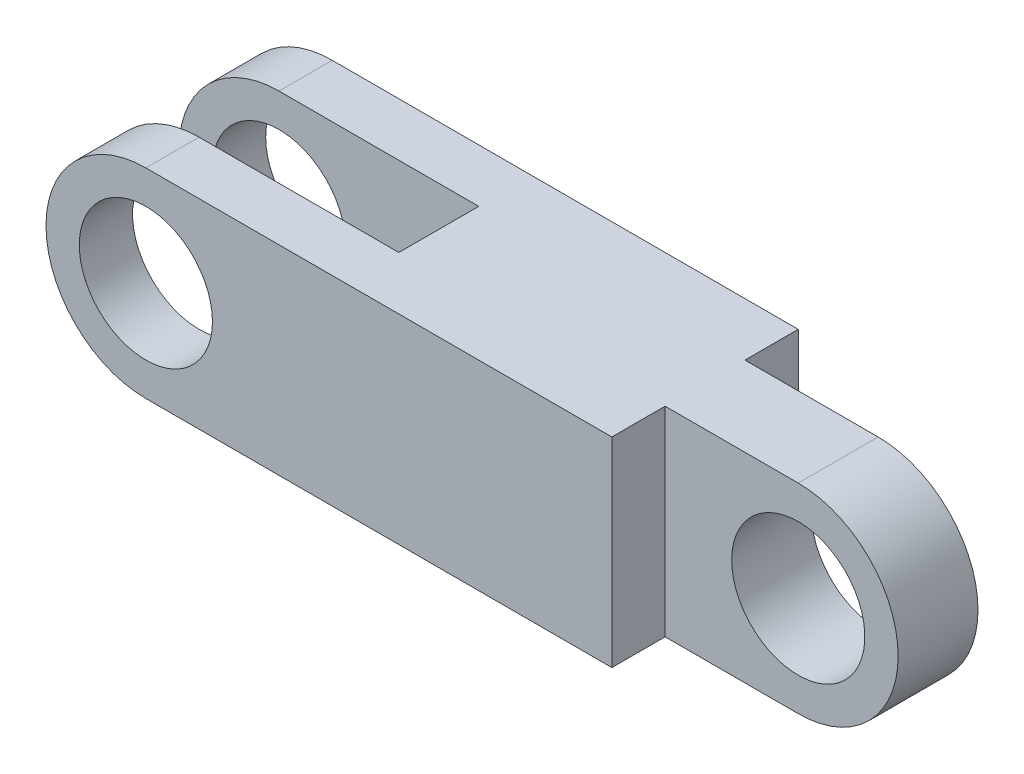
ISO-10303-21;
HEADER;
FILE_DESCRIPTION(('STEP AP214'),'2;1');
FILE_NAME('part.step','',(''),(''),'','','');
FILE_SCHEMA(('AUTOMOTIVE_DESIGN { 1 0 10303 214 1 1 1 1 }'));
ENDSEC;
DATA;
#1=APPLICATION_CONTEXT('core data for automotive mechanical design processes');
#2=APPLICATION_PROTOCOL_DEFINITION('international standard','automotive_design',2000,#1);
#3=PRODUCT_CONTEXT('',#1,'mechanical');
#4=PRODUCT('Part','Part','',(#3));
#5=PRODUCT_RELATED_PRODUCT_CATEGORY('part','',(#4));
#6=PRODUCT_DEFINITION_FORMATION('','',#4);
#7=PRODUCT_DEFINITION_CONTEXT('part definition',#1,'design');
#8=PRODUCT_DEFINITION('design','',#6,#7);
#9=PRODUCT_DEFINITION_SHAPE('','',#8);
#10=(LENGTH_UNIT() NAMED_UNIT(*) SI_UNIT(.MILLI.,.METRE.));
#11=(NAMED_UNIT(*) PLANE_ANGLE_UNIT() SI_UNIT($,.RADIAN.));
#12=(NAMED_UNIT(*) SI_UNIT($,.STERADIAN.) SOLID_ANGLE_UNIT());
#13=UNCERTAINTY_MEASURE_WITH_UNIT(LENGTH_MEASURE(1.E-05),#10,'distance_accuracy_value','');
#14=(GEOMETRIC_REPRESENTATION_CONTEXT(3) GLOBAL_UNCERTAINTY_ASSIGNED_CONTEXT((#13)) GLOBAL_UNIT_ASSIGNED_CONTEXT((#10,
#11,#12)) REPRESENTATION_CONTEXT('',''));
#15=CARTESIAN_POINT('',(0.,0.,0.));
#16=DIRECTION('',(0.,0.,1.));
#17=DIRECTION('',(1.,0.,0.));
#18=AXIS2_PLACEMENT_3D('',#15,#16,#17);
#19=CARTESIAN_POINT('',(0.,0.,14.));
#20=DIRECTION('',(0.,0.,1.));
#21=DIRECTION('',(1.,0.,0.));
#22=AXIS2_PLACEMENT_3D('',#19,#20,#21);
#23=PLANE('',#22);
#24=CARTESIAN_POINT('',(0.,7.5,14.));
#25=DIRECTION('',(0.,0.,1.));
#26=DIRECTION('',(1.,0.,0.));
#27=AXIS2_PLACEMENT_3D('',#24,#25,#26);
#28=CIRCLE('',#27,5.);
#29=CARTESIAN_POINT('',(5.,7.5,14.));
#30=VERTEX_POINT('',#29);
#31=EDGE_CURVE('E211',#30,#30,#28,.T.);
#32=ORIENTED_EDGE('',*,*,#31,.F.);
#33=EDGE_LOOP('',(#32));
#34=FACE_BOUND('',#33,.T.);
#35=DIRECTION('',(1.,0.,0.));
#36=VECTOR('',#35,1.);
#37=CARTESIAN_POINT('',(0.,0.,14.));
#38=LINE('',#37,#36);
#39=CARTESIAN_POINT('',(0.,0.,14.));
#40=VERTEX_POINT('',#39);
#41=CARTESIAN_POINT('',(35.,0.,14.));
#42=VERTEX_POINT('',#41);
#43=EDGE_CURVE('E208',#40,#42,#38,.T.);
#44=ORIENTED_EDGE('',*,*,#43,.T.);
#45=DIRECTION('',(0.,1.,0.));
#46=VECTOR('',#45,1.);
#47=CARTESIAN_POINT('',(35.,0.,14.));
#48=LINE('',#47,#46);
#49=CARTESIAN_POINT('',(35.,15.,14.));
#50=VERTEX_POINT('',#49);
#51=EDGE_CURVE('E171',#42,#50,#48,.T.);
#52=ORIENTED_EDGE('',*,*,#51,.T.);
#53=DIRECTION('',(1.,0.,0.));
#54=VECTOR('',#53,1.);
#55=CARTESIAN_POINT('',(0.,15.,14.));
#56=LINE('',#55,#54);
#57=CARTESIAN_POINT('',(0.,15.,14.));
#58=VERTEX_POINT('',#57);
#59=EDGE_CURVE('E202',#58,#50,#56,.T.);
#60=ORIENTED_EDGE('',*,*,#59,.F.);
#61=CARTESIAN_POINT('',(0.,7.5,14.));
#62=DIRECTION('',(0.,0.,1.));
#63=DIRECTION('',(1.,0.,0.));
#64=AXIS2_PLACEMENT_3D('',#61,#62,#63);
#65=CIRCLE('',#64,7.5);
#66=EDGE_CURVE('E205',#58,#40,#65,.T.);
#67=ORIENTED_EDGE('',*,*,#66,.T.);
#68=EDGE_LOOP('',(#44,#52,#60,#67));
#69=FACE_BOUND('',#68,.T.);
#70=ADVANCED_FACE('F41',(#34,#69),#23,.T.);
#71=CARTESIAN_POINT('',(0.,0.,0.));
#72=DIRECTION('',(0.,0.,1.));
#73=DIRECTION('',(1.,0.,0.));
#74=AXIS2_PLACEMENT_3D('',#71,#72,#73);
#75=PLANE('',#74);
#76=DIRECTION('',(1.,0.,0.));
#77=VECTOR('',#76,1.);
#78=CARTESIAN_POINT('',(0.,15.,0.));
#79=LINE('',#78,#77);
#80=CARTESIAN_POINT('',(0.,15.,0.));
#81=VERTEX_POINT('',#80);
#82=CARTESIAN_POINT('',(35.,15.,0.));
#83=VERTEX_POINT('',#82);
#84=EDGE_CURVE('E201',#81,#83,#79,.T.);
#85=ORIENTED_EDGE('',*,*,#84,.T.);
#86=DIRECTION('',(0.,1.,0.));
#87=VECTOR('',#86,1.);
#88=CARTESIAN_POINT('',(35.,0.,0.));
#89=LINE('',#88,#87);
#90=CARTESIAN_POINT('',(35.,0.,0.));
#91=VERTEX_POINT('',#90);
#92=EDGE_CURVE('E167',#91,#83,#89,.T.);
#93=ORIENTED_EDGE('',*,*,#92,.F.);
#94=DIRECTION('',(1.,0.,0.));
#95=VECTOR('',#94,1.);
#96=CARTESIAN_POINT('',(0.,0.,0.));
#97=LINE('',#96,#95);
#98=CARTESIAN_POINT('',(0.,0.,0.));
#99=VERTEX_POINT('',#98);
#100=EDGE_CURVE('E220',#99,#91,#97,.T.);
#101=ORIENTED_EDGE('',*,*,#100,.F.);
#102=CARTESIAN_POINT('',(0.,7.5,0.));
#103=DIRECTION('',(0.,0.,1.));
#104=DIRECTION('',(1.,0.,0.));
#105=AXIS2_PLACEMENT_3D('',#102,#103,#104);
#106=CIRCLE('',#105,7.5);
#107=EDGE_CURVE('E217',#81,#99,#106,.T.);
#108=ORIENTED_EDGE('',*,*,#107,.F.);
#109=EDGE_LOOP('',(#85,#93,#101,#108));
#110=FACE_BOUND('',#109,.T.);
#111=CARTESIAN_POINT('',(0.,7.5,0.));
#112=DIRECTION('',(0.,0.,1.));
#113=DIRECTION('',(1.,0.,0.));
#114=AXIS2_PLACEMENT_3D('',#111,#112,#113);
#115=CIRCLE('',#114,5.);
#116=CARTESIAN_POINT('',(5.,7.5,0.));
#117=VERTEX_POINT('',#116);
#118=EDGE_CURVE('E206',#117,#117,#115,.T.);
#119=ORIENTED_EDGE('',*,*,#118,.T.);
#120=EDGE_LOOP('',(#119));
#121=FACE_BOUND('',#120,.T.);
#122=ADVANCED_FACE('F279',(#110,#121),#75,.F.);
#123=CARTESIAN_POINT('',(0.,0.,14.));
#124=DIRECTION('',(0.,1.,0.));
#125=DIRECTION('',(0.,0.,1.));
#126=AXIS2_PLACEMENT_3D('',#123,#124,#125);
#127=PLANE('',#126);
#128=DIRECTION('',(0.,0.,1.));
#129=VECTOR('',#128,1.);
#130=CARTESIAN_POINT('',(15.,0.,0.));
#131=LINE('',#130,#129);
#132=CARTESIAN_POINT('',(15.,0.,4.));
#133=VERTEX_POINT('',#132);
#134=CARTESIAN_POINT('',(15.,0.,10.));
#135=VERTEX_POINT('',#134);
#136=EDGE_CURVE('E135',#133,#135,#131,.T.);
#137=ORIENTED_EDGE('',*,*,#136,.F.);
#138=DIRECTION('',(-1.,0.,0.));
#139=VECTOR('',#138,1.);
#140=CARTESIAN_POINT('',(0.,0.,4.));
#141=LINE('',#140,#139);
#142=CARTESIAN_POINT('',(0.,0.,4.));
#143=VERTEX_POINT('',#142);
#144=EDGE_CURVE('E144',#133,#143,#141,.T.);
#145=ORIENTED_EDGE('',*,*,#144,.T.);
#146=DIRECTION('',(0.,0.,-1.));
#147=VECTOR('',#146,1.);
#148=CARTESIAN_POINT('',(0.,0.,14.));
#149=LINE('',#148,#147);
#150=EDGE_CURVE('E227',#143,#99,#149,.T.);
#151=ORIENTED_EDGE('',*,*,#150,.T.);
#152=ORIENTED_EDGE('',*,*,#100,.T.);
#153=DIRECTION('',(0.,0.,1.));
#154=VECTOR('',#153,1.);
#155=CARTESIAN_POINT('',(35.,0.,0.));
#156=LINE('',#155,#154);
#157=CARTESIAN_POINT('',(35.,0.,4.00000000000001));
#158=VERTEX_POINT('',#157);
#159=EDGE_CURVE('E161',#91,#158,#156,.T.);
#160=ORIENTED_EDGE('',*,*,#159,.T.);
#161=DIRECTION('',(-1.,0.,0.));
#162=VECTOR('',#161,1.);
#163=CARTESIAN_POINT('',(0.,0.,4.00000000000001));
#164=LINE('',#163,#162);
#165=CARTESIAN_POINT('',(45.,0.,4.));
#166=VERTEX_POINT('',#165);
#167=EDGE_CURVE('E164',#166,#158,#164,.T.);
#168=ORIENTED_EDGE('',*,*,#167,.F.);
#169=DIRECTION('',(0.,0.,-1.));
#170=VECTOR('',#169,1.);
#171=CARTESIAN_POINT('',(45.,0.,14.));
#172=LINE('',#171,#170);
#173=CARTESIAN_POINT('',(45.,0.,10.));
#174=VERTEX_POINT('',#173);
#175=EDGE_CURVE('E214',#174,#166,#172,.T.);
#176=ORIENTED_EDGE('',*,*,#175,.F.);
#177=DIRECTION('',(-1.,0.,0.));
#178=VECTOR('',#177,1.);
#179=CARTESIAN_POINT('',(0.,0.,10.));
#180=LINE('',#179,#178);
#181=CARTESIAN_POINT('',(35.,0.,10.));
#182=VERTEX_POINT('',#181);
#183=EDGE_CURVE('E176',#174,#182,#180,.T.);
#184=ORIENTED_EDGE('',*,*,#183,.T.);
#185=DIRECTION('',(0.,0.,-1.));
#186=VECTOR('',#185,1.);
#187=CARTESIAN_POINT('',(35.,0.,0.));
#188=LINE('',#187,#186);
#189=EDGE_CURVE('E179',#42,#182,#188,.T.);
#190=ORIENTED_EDGE('',*,*,#189,.F.);
#191=ORIENTED_EDGE('',*,*,#43,.F.);
#192=CARTESIAN_POINT('',(0.,0.,10.));
#193=VERTEX_POINT('',#192);
#194=EDGE_CURVE('E228',#40,#193,#149,.T.);
#195=ORIENTED_EDGE('',*,*,#194,.T.);
#196=DIRECTION('',(1.,0.,0.));
#197=VECTOR('',#196,1.);
#198=CARTESIAN_POINT('',(0.,0.,10.));
#199=LINE('',#198,#197);
#200=EDGE_CURVE('E11',#193,#135,#199,.T.);
#201=ORIENTED_EDGE('',*,*,#200,.T.);
#202=EDGE_LOOP('',(#137,#145,#151,#152,#160,#168,#176,#184,#190,#191,#195,#201));
#203=FACE_BOUND('',#202,.T.);
#204=ADVANCED_FACE('F150',(#203),#127,.F.);
#205=CARTESIAN_POINT('',(0.,7.5,14.));
#206=DIRECTION('',(0.,0.,-1.));
#207=DIRECTION('',(-1.,0.,0.));
#208=AXIS2_PLACEMENT_3D('',#205,#206,#207);
#209=CYLINDRICAL_SURFACE('',#208,5.);
#210=CARTESIAN_POINT('',(0.,7.5,10.));
#211=DIRECTION('',(0.,0.,1.));
#212=DIRECTION('',(1.,0.,0.));
#213=AXIS2_PLACEMENT_3D('',#210,#211,#212);
#214=CIRCLE('',#213,5.);
#215=CARTESIAN_POINT('',(5.,7.5,10.));
#216=VERTEX_POINT('',#215);
#217=EDGE_CURVE('E192',#216,#216,#214,.T.);
#218=ORIENTED_EDGE('',*,*,#217,.F.);
#219=EDGE_LOOP('',(#218));
#220=FACE_BOUND('',#219,.T.);
#221=ORIENTED_EDGE('',*,*,#31,.T.);
#222=EDGE_LOOP('',(#221));
#223=FACE_BOUND('',#222,.T.);
#224=ADVANCED_FACE('F295',(#220,#223),#209,.F.);
#225=CARTESIAN_POINT('',(0.,7.5,4.));
#226=DIRECTION('',(0.,0.,-1.));
#227=DIRECTION('',(-1.,0.,0.));
#228=AXIS2_PLACEMENT_3D('',#225,#226,#227);
#229=CIRCLE('',#228,5.);
#230=CARTESIAN_POINT('',(-5.,7.5,4.));
#231=VERTEX_POINT('',#230);
#232=EDGE_CURVE('E197',#231,#231,#229,.T.);
#233=ORIENTED_EDGE('',*,*,#232,.F.);
#234=EDGE_LOOP('',(#233));
#235=FACE_BOUND('',#234,.T.);
#236=ORIENTED_EDGE('',*,*,#118,.F.);
#237=EDGE_LOOP('',(#236));
#238=FACE_BOUND('',#237,.T.);
#239=ADVANCED_FACE('F298',(#235,#238),#209,.F.);
#240=CARTESIAN_POINT('',(0.,7.5,14.));
#241=DIRECTION('',(0.,0.,-1.));
#242=DIRECTION('',(-1.,0.,0.));
#243=AXIS2_PLACEMENT_3D('',#240,#241,#242);
#244=CYLINDRICAL_SURFACE('',#243,7.5);
#245=DIRECTION('',(0.,0.,-1.));
#246=VECTOR('',#245,1.);
#247=CARTESIAN_POINT('',(0.,15.,14.));
#248=LINE('',#247,#246);
#249=CARTESIAN_POINT('',(0.,15.,10.));
#250=VERTEX_POINT('',#249);
#251=EDGE_CURVE('E231',#58,#250,#248,.T.);
#252=ORIENTED_EDGE('',*,*,#251,.T.);
#253=CARTESIAN_POINT('',(0.,7.5,10.));
#254=DIRECTION('',(0.,0.,1.));
#255=DIRECTION('',(1.,0.,0.));
#256=AXIS2_PLACEMENT_3D('',#253,#254,#255);
#257=CIRCLE('',#256,7.5);
#258=EDGE_CURVE('E195',#250,#193,#257,.T.);
#259=ORIENTED_EDGE('',*,*,#258,.T.);
#260=ORIENTED_EDGE('',*,*,#194,.F.);
#261=ORIENTED_EDGE('',*,*,#66,.F.);
#262=EDGE_LOOP('',(#252,#259,#260,#261));
#263=FACE_BOUND('',#262,.T.);
#264=ADVANCED_FACE('F265',(#263),#244,.T.);
#265=CARTESIAN_POINT('',(0.,7.5,4.));
#266=DIRECTION('',(0.,0.,-1.));
#267=DIRECTION('',(-1.,0.,0.));
#268=AXIS2_PLACEMENT_3D('',#265,#266,#267);
#269=CIRCLE('',#268,7.5);
#270=CARTESIAN_POINT('',(0.,15.,4.));
#271=VERTEX_POINT('',#270);
#272=EDGE_CURVE('E146',#143,#271,#269,.T.);
#273=ORIENTED_EDGE('',*,*,#272,.T.);
#274=EDGE_CURVE('E230',#271,#81,#248,.T.);
#275=ORIENTED_EDGE('',*,*,#274,.T.);
#276=ORIENTED_EDGE('',*,*,#107,.T.);
#277=ORIENTED_EDGE('',*,*,#150,.F.);
#278=EDGE_LOOP('',(#273,#275,#276,#277));
#279=FACE_BOUND('',#278,.T.);
#280=ADVANCED_FACE('F303',(#279),#244,.T.);
#281=CARTESIAN_POINT('',(0.,15.,14.));
#282=DIRECTION('',(0.,1.,0.));
#283=DIRECTION('',(0.,0.,1.));
#284=AXIS2_PLACEMENT_3D('',#281,#282,#283);
#285=PLANE('',#284);
#286=DIRECTION('',(-1.,0.,0.));
#287=VECTOR('',#286,1.);
#288=CARTESIAN_POINT('',(0.,15.,4.));
#289=LINE('',#288,#287);
#290=CARTESIAN_POINT('',(15.,15.,4.));
#291=VERTEX_POINT('',#290);
#292=EDGE_CURVE('E152',#291,#271,#289,.T.);
#293=ORIENTED_EDGE('',*,*,#292,.F.);
#294=DIRECTION('',(0.,0.,1.));
#295=VECTOR('',#294,1.);
#296=CARTESIAN_POINT('',(15.,15.,0.));
#297=LINE('',#296,#295);
#298=CARTESIAN_POINT('',(15.,15.,10.));
#299=VERTEX_POINT('',#298);
#300=EDGE_CURVE('E137',#291,#299,#297,.T.);
#301=ORIENTED_EDGE('',*,*,#300,.T.);
#302=DIRECTION('',(1.,0.,0.));
#303=VECTOR('',#302,1.);
#304=CARTESIAN_POINT('',(0.,15.,10.));
#305=LINE('',#304,#303);
#306=EDGE_CURVE('E156',#250,#299,#305,.T.);
#307=ORIENTED_EDGE('',*,*,#306,.F.);
#308=ORIENTED_EDGE('',*,*,#251,.F.);
#309=ORIENTED_EDGE('',*,*,#59,.T.);
#310=DIRECTION('',(0.,0.,-1.));
#311=VECTOR('',#310,1.);
#312=CARTESIAN_POINT('',(35.,15.,0.));
#313=LINE('',#312,#311);
#314=CARTESIAN_POINT('',(35.,15.,10.));
#315=VERTEX_POINT('',#314);
#316=EDGE_CURVE('E64',#50,#315,#313,.T.);
#317=ORIENTED_EDGE('',*,*,#316,.T.);
#318=DIRECTION('',(-1.,0.,0.));
#319=VECTOR('',#318,1.);
#320=CARTESIAN_POINT('',(0.,15.,10.));
#321=LINE('',#320,#319);
#322=CARTESIAN_POINT('',(45.,15.,10.));
#323=VERTEX_POINT('',#322);
#324=EDGE_CURVE('E182',#323,#315,#321,.T.);
#325=ORIENTED_EDGE('',*,*,#324,.F.);
#326=DIRECTION('',(0.,0.,-1.));
#327=VECTOR('',#326,1.);
#328=CARTESIAN_POINT('',(45.,15.,14.));
#329=LINE('',#328,#327);
#330=CARTESIAN_POINT('',(45.,15.,4.));
#331=VERTEX_POINT('',#330);
#332=EDGE_CURVE('E49',#323,#331,#329,.T.);
#333=ORIENTED_EDGE('',*,*,#332,.T.);
#334=DIRECTION('',(-1.,0.,0.));
#335=VECTOR('',#334,1.);
#336=CARTESIAN_POINT('',(0.,15.,4.00000000000001));
#337=LINE('',#336,#335);
#338=CARTESIAN_POINT('',(35.,15.,4.00000000000001));
#339=VERTEX_POINT('',#338);
#340=EDGE_CURVE('E165',#331,#339,#337,.T.);
#341=ORIENTED_EDGE('',*,*,#340,.T.);
#342=DIRECTION('',(0.,0.,1.));
#343=VECTOR('',#342,1.);
#344=CARTESIAN_POINT('',(35.,15.,0.));
#345=LINE('',#344,#343);
#346=EDGE_CURVE('E168',#83,#339,#345,.T.);
#347=ORIENTED_EDGE('',*,*,#346,.F.);
#348=ORIENTED_EDGE('',*,*,#84,.F.);
#349=ORIENTED_EDGE('',*,*,#274,.F.);
#350=EDGE_LOOP('',(#293,#301,#307,#308,#309,#317,#325,#333,#341,#347,#348,#349));
#351=FACE_BOUND('',#350,.T.);
#352=ADVANCED_FACE('F304',(#351),#285,.T.);
#353=CARTESIAN_POINT('',(45.,7.5,14.));
#354=DIRECTION('',(0.,0.,-1.));
#355=DIRECTION('',(-1.,0.,0.));
#356=AXIS2_PLACEMENT_3D('',#353,#354,#355);
#357=CYLINDRICAL_SURFACE('',#356,7.5);
#358=CARTESIAN_POINT('',(45.,7.5,4.));
#359=DIRECTION('',(0.,0.,-1.));
#360=DIRECTION('',(-1.,0.,0.));
#361=AXIS2_PLACEMENT_3D('',#358,#359,#360);
#362=CIRCLE('',#361,7.5);
#363=EDGE_CURVE('E190',#331,#166,#362,.T.);
#364=ORIENTED_EDGE('',*,*,#363,.F.);
#365=ORIENTED_EDGE('',*,*,#332,.F.);
#366=CARTESIAN_POINT('',(45.,7.5,10.));
#367=DIRECTION('',(0.,0.,-1.));
#368=DIRECTION('',(-1.,0.,0.));
#369=AXIS2_PLACEMENT_3D('',#366,#367,#368);
#370=CIRCLE('',#369,7.5);
#371=EDGE_CURVE('E187',#323,#174,#370,.T.);
#372=ORIENTED_EDGE('',*,*,#371,.T.);
#373=ORIENTED_EDGE('',*,*,#175,.T.);
#374=EDGE_LOOP('',(#364,#365,#372,#373));
#375=FACE_BOUND('',#374,.T.);
#376=ADVANCED_FACE('F43',(#375),#357,.T.);
#377=CARTESIAN_POINT('',(0.,0.,4.00000000000001));
#378=DIRECTION('',(0.,0.,-1.));
#379=DIRECTION('',(-1.,0.,0.));
#380=AXIS2_PLACEMENT_3D('',#377,#378,#379);
#381=PLANE('',#380);
#382=CARTESIAN_POINT('',(45.,7.5,4.));
#383=DIRECTION('',(0.,0.,-1.));
#384=DIRECTION('',(-1.,0.,0.));
#385=AXIS2_PLACEMENT_3D('',#382,#383,#384);
#386=CIRCLE('',#385,5.);
#387=CARTESIAN_POINT('',(40.,7.5,4.));
#388=VERTEX_POINT('',#387);
#389=EDGE_CURVE('E189',#388,#388,#386,.T.);
#390=ORIENTED_EDGE('',*,*,#389,.F.);
#391=EDGE_LOOP('',(#390));
#392=FACE_BOUND('',#391,.T.);
#393=ORIENTED_EDGE('',*,*,#363,.T.);
#394=ORIENTED_EDGE('',*,*,#167,.T.);
#395=DIRECTION('',(0.,1.,0.));
#396=VECTOR('',#395,1.);
#397=CARTESIAN_POINT('',(35.,0.,4.00000000000001));
#398=LINE('',#397,#396);
#399=EDGE_CURVE('E158',#158,#339,#398,.T.);
#400=ORIENTED_EDGE('',*,*,#399,.T.);
#401=ORIENTED_EDGE('',*,*,#340,.F.);
#402=EDGE_LOOP('',(#393,#394,#400,#401));
#403=FACE_BOUND('',#402,.T.);
#404=ADVANCED_FACE('F242',(#392,#403),#381,.T.);
#405=CARTESIAN_POINT('',(35.,0.,0.));
#406=DIRECTION('',(-1.,0.,0.));
#407=DIRECTION('',(0.,0.,1.));
#408=AXIS2_PLACEMENT_3D('',#405,#406,#407);
#409=PLANE('',#408);
#410=ORIENTED_EDGE('',*,*,#346,.T.);
#411=ORIENTED_EDGE('',*,*,#399,.F.);
#412=ORIENTED_EDGE('',*,*,#159,.F.);
#413=ORIENTED_EDGE('',*,*,#92,.T.);
#414=EDGE_LOOP('',(#410,#411,#412,#413));
#415=FACE_BOUND('',#414,.T.);
#416=ADVANCED_FACE('F245',(#415),#409,.F.);
#417=CARTESIAN_POINT('',(0.,0.,10.));
#418=DIRECTION('',(0.,0.,-1.));
#419=DIRECTION('',(-1.,0.,0.));
#420=AXIS2_PLACEMENT_3D('',#417,#418,#419);
#421=PLANE('',#420);
#422=CARTESIAN_POINT('',(45.,7.5,10.));
#423=DIRECTION('',(0.,0.,-1.));
#424=DIRECTION('',(-1.,0.,0.));
#425=AXIS2_PLACEMENT_3D('',#422,#423,#424);
#426=CIRCLE('',#425,5.);
#427=CARTESIAN_POINT('',(40.,7.5,10.));
#428=VERTEX_POINT('',#427);
#429=EDGE_CURVE('E141',#428,#428,#426,.T.);
#430=ORIENTED_EDGE('',*,*,#429,.T.);
#431=EDGE_LOOP('',(#430));
#432=FACE_BOUND('',#431,.T.);
#433=ORIENTED_EDGE('',*,*,#324,.T.);
#434=DIRECTION('',(0.,1.,0.));
#435=VECTOR('',#434,1.);
#436=CARTESIAN_POINT('',(35.,0.,10.));
#437=LINE('',#436,#435);
#438=EDGE_CURVE('E181',#182,#315,#437,.T.);
#439=ORIENTED_EDGE('',*,*,#438,.F.);
#440=ORIENTED_EDGE('',*,*,#183,.F.);
#441=ORIENTED_EDGE('',*,*,#371,.F.);
#442=EDGE_LOOP('',(#433,#439,#440,#441));
#443=FACE_BOUND('',#442,.T.);
#444=ADVANCED_FACE('F257',(#432,#443),#421,.F.);
#445=CARTESIAN_POINT('',(35.,0.,0.));
#446=DIRECTION('',(1.,0.,0.));
#447=DIRECTION('',(0.,0.,-1.));
#448=AXIS2_PLACEMENT_3D('',#445,#446,#447);
#449=PLANE('',#448);
#450=ORIENTED_EDGE('',*,*,#316,.F.);
#451=ORIENTED_EDGE('',*,*,#51,.F.);
#452=ORIENTED_EDGE('',*,*,#189,.T.);
#453=ORIENTED_EDGE('',*,*,#438,.T.);
#454=EDGE_LOOP('',(#450,#451,#452,#453));
#455=FACE_BOUND('',#454,.T.);
#456=ADVANCED_FACE('F293',(#455),#449,.T.);
#457=CARTESIAN_POINT('',(45.,7.5,14.));
#458=DIRECTION('',(0.,0.,-1.));
#459=DIRECTION('',(-1.,0.,0.));
#460=AXIS2_PLACEMENT_3D('',#457,#458,#459);
#461=CYLINDRICAL_SURFACE('',#460,5.);
#462=ORIENTED_EDGE('',*,*,#429,.F.);
#463=EDGE_LOOP('',(#462));
#464=FACE_BOUND('',#463,.T.);
#465=ORIENTED_EDGE('',*,*,#389,.T.);
#466=EDGE_LOOP('',(#465));
#467=FACE_BOUND('',#466,.T.);
#468=ADVANCED_FACE('F240',(#464,#467),#461,.F.);
#469=CARTESIAN_POINT('',(0.,0.,4.));
#470=DIRECTION('',(0.,0.,-1.));
#471=DIRECTION('',(-1.,0.,0.));
#472=AXIS2_PLACEMENT_3D('',#469,#470,#471);
#473=PLANE('',#472);
#474=ORIENTED_EDGE('',*,*,#232,.T.);
#475=EDGE_LOOP('',(#474));
#476=FACE_BOUND('',#475,.T.);
#477=ORIENTED_EDGE('',*,*,#272,.F.);
#478=ORIENTED_EDGE('',*,*,#144,.F.);
#479=DIRECTION('',(0.,1.,0.));
#480=VECTOR('',#479,1.);
#481=CARTESIAN_POINT('',(15.,0.,4.));
#482=LINE('',#481,#480);
#483=EDGE_CURVE('E131',#133,#291,#482,.T.);
#484=ORIENTED_EDGE('',*,*,#483,.T.);
#485=ORIENTED_EDGE('',*,*,#292,.T.);
#486=EDGE_LOOP('',(#477,#478,#484,#485));
#487=FACE_BOUND('',#486,.T.);
#488=ADVANCED_FACE('F145',(#476,#487),#473,.F.);
#489=CARTESIAN_POINT('',(0.,0.,10.));
#490=DIRECTION('',(0.,0.,1.));
#491=DIRECTION('',(1.,0.,0.));
#492=AXIS2_PLACEMENT_3D('',#489,#490,#491);
#493=PLANE('',#492);
#494=ORIENTED_EDGE('',*,*,#217,.T.);
#495=EDGE_LOOP('',(#494));
#496=FACE_BOUND('',#495,.T.);
#497=ORIENTED_EDGE('',*,*,#306,.T.);
#498=DIRECTION('',(0.,1.,0.));
#499=VECTOR('',#498,1.);
#500=CARTESIAN_POINT('',(15.,0.,10.));
#501=LINE('',#500,#499);
#502=EDGE_CURVE('E56',#135,#299,#501,.T.);
#503=ORIENTED_EDGE('',*,*,#502,.F.);
#504=ORIENTED_EDGE('',*,*,#200,.F.);
#505=ORIENTED_EDGE('',*,*,#258,.F.);
#506=EDGE_LOOP('',(#497,#503,#504,#505));
#507=FACE_BOUND('',#506,.T.);
#508=ADVANCED_FACE('F267',(#496,#507),#493,.F.);
#509=CARTESIAN_POINT('',(15.,0.,0.));
#510=DIRECTION('',(-1.,0.,0.));
#511=DIRECTION('',(0.,0.,1.));
#512=AXIS2_PLACEMENT_3D('',#509,#510,#511);
#513=PLANE('',#512);
#514=ORIENTED_EDGE('',*,*,#300,.F.);
#515=ORIENTED_EDGE('',*,*,#483,.F.);
#516=ORIENTED_EDGE('',*,*,#136,.T.);
#517=ORIENTED_EDGE('',*,*,#502,.T.);
#518=EDGE_LOOP('',(#514,#515,#516,#517));
#519=FACE_BOUND('',#518,.T.);
#520=ADVANCED_FACE('F133',(#519),#513,.T.);
#521=CLOSED_SHELL('',(#70,#122,#204,#224,#239,#264,#280,#352,#376,#404,#416,#444,#456,#468,#488,
#508,#520));
#522=MANIFOLD_SOLID_BREP('B2',#521);
#523=ADVANCED_BREP_SHAPE_REPRESENTATION('',(#18,#522),#14);
#524=SHAPE_DEFINITION_REPRESENTATION(#9,#523);
ENDSEC;
END-ISO-10303-21;
